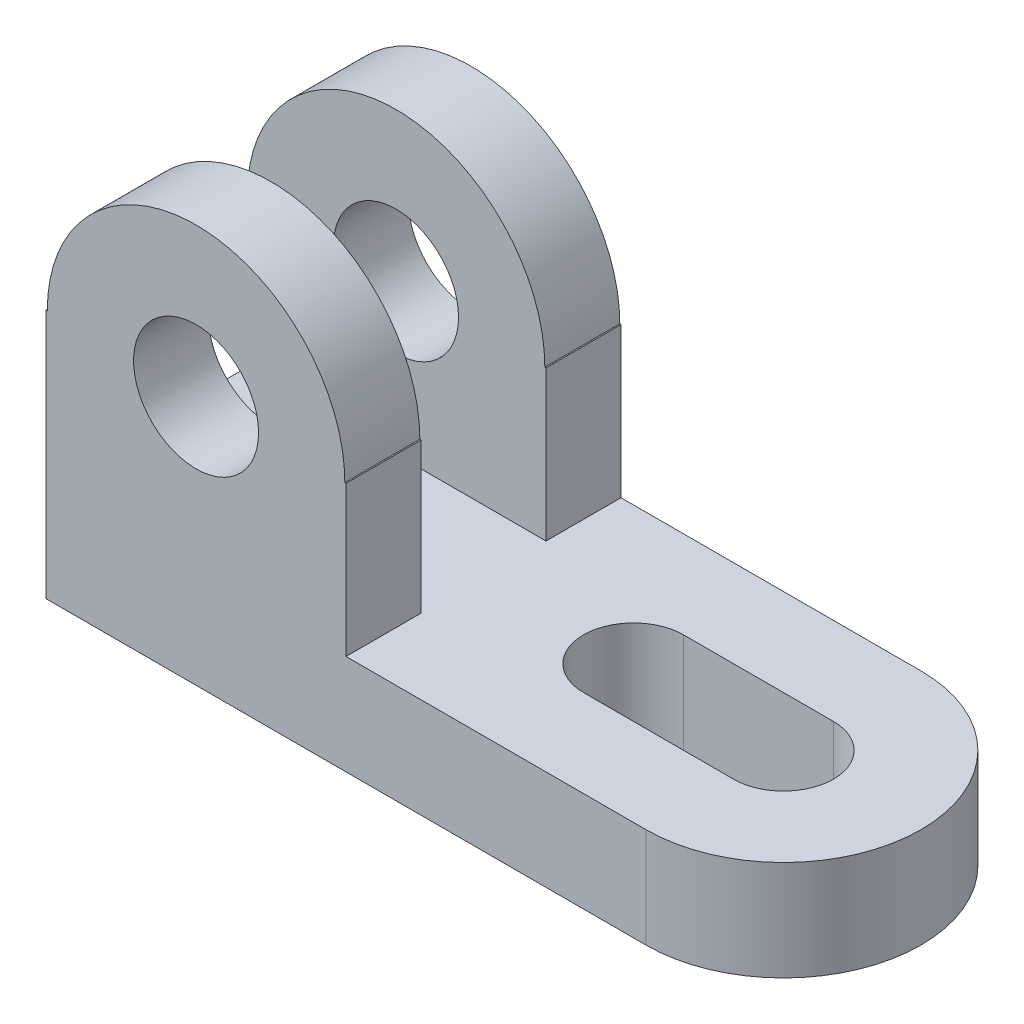
ISO-10303-21;
HEADER;
FILE_DESCRIPTION(('STEP AP214'),'2;1');
FILE_NAME('part.step','',(''),(''),'','','');
FILE_SCHEMA(('AUTOMOTIVE_DESIGN { 1 0 10303 214 1 1 1 1 }'));
ENDSEC;
DATA;
#1=APPLICATION_CONTEXT('core data for automotive mechanical design processes');
#2=APPLICATION_PROTOCOL_DEFINITION('international standard','automotive_design',2000,#1);
#3=PRODUCT_CONTEXT('',#1,'mechanical');
#4=PRODUCT('Part','Part','',(#3));
#5=PRODUCT_RELATED_PRODUCT_CATEGORY('part','',(#4));
#6=PRODUCT_DEFINITION_FORMATION('','',#4);
#7=PRODUCT_DEFINITION_CONTEXT('part definition',#1,'design');
#8=PRODUCT_DEFINITION('design','',#6,#7);
#9=PRODUCT_DEFINITION_SHAPE('','',#8);
#10=(LENGTH_UNIT() NAMED_UNIT(*) SI_UNIT(.MILLI.,.METRE.));
#11=(NAMED_UNIT(*) PLANE_ANGLE_UNIT() SI_UNIT($,.RADIAN.));
#12=(NAMED_UNIT(*) SI_UNIT($,.STERADIAN.) SOLID_ANGLE_UNIT());
#13=UNCERTAINTY_MEASURE_WITH_UNIT(LENGTH_MEASURE(1.E-05),#10,'distance_accuracy_value','');
#14=(GEOMETRIC_REPRESENTATION_CONTEXT(3) GLOBAL_UNCERTAINTY_ASSIGNED_CONTEXT((#13)) GLOBAL_UNIT_ASSIGNED_CONTEXT((#10,
#11,#12)) REPRESENTATION_CONTEXT('',''));
#15=CARTESIAN_POINT('',(0.,0.,0.));
#16=DIRECTION('',(0.,0.,1.));
#17=DIRECTION('',(1.,0.,0.));
#18=AXIS2_PLACEMENT_3D('',#15,#16,#17);
#19=CARTESIAN_POINT('',(0.,16.,0.));
#20=DIRECTION('',(0.,1.,0.));
#21=DIRECTION('',(0.,0.,1.));
#22=AXIS2_PLACEMENT_3D('',#19,#20,#21);
#23=PLANE('',#22);
#24=CARTESIAN_POINT('',(37.,16.,0.));
#25=DIRECTION('',(0.,1.,0.));
#26=DIRECTION('',(0.,0.,1.));
#27=AXIS2_PLACEMENT_3D('',#24,#25,#26);
#28=CIRCLE('',#27,8.);
#29=CARTESIAN_POINT('',(37.,16.,8.));
#30=VERTEX_POINT('',#29);
#31=CARTESIAN_POINT('',(37.,16.,-8.));
#32=VERTEX_POINT('',#31);
#33=EDGE_CURVE('E285',#30,#32,#28,.T.);
#34=ORIENTED_EDGE('',*,*,#33,.F.);
#35=DIRECTION('',(1.,0.,0.));
#36=VECTOR('',#35,1.);
#37=CARTESIAN_POINT('',(37.,16.,8.));
#38=LINE('',#37,#36);
#39=CARTESIAN_POINT('',(13.,16.,8.));
#40=VERTEX_POINT('',#39);
#41=EDGE_CURVE('E303',#40,#30,#38,.T.);
#42=ORIENTED_EDGE('',*,*,#41,.F.);
#43=CARTESIAN_POINT('',(13.,16.,0.));
#44=DIRECTION('',(0.,1.,0.));
#45=DIRECTION('',(0.,0.,1.));
#46=AXIS2_PLACEMENT_3D('',#43,#44,#45);
#47=CIRCLE('',#46,8.);
#48=CARTESIAN_POINT('',(13.,16.,-8.));
#49=VERTEX_POINT('',#48);
#50=EDGE_CURVE('E322',#49,#40,#47,.T.);
#51=ORIENTED_EDGE('',*,*,#50,.F.);
#52=DIRECTION('',(-1.,0.,0.));
#53=VECTOR('',#52,1.);
#54=CARTESIAN_POINT('',(37.,16.,-8.));
#55=LINE('',#54,#53);
#56=EDGE_CURVE('E318',#32,#49,#55,.T.);
#57=ORIENTED_EDGE('',*,*,#56,.F.);
#58=EDGE_LOOP('',(#34,#42,#51,#57));
#59=FACE_BOUND('',#58,.T.);
#60=DIRECTION('',(1.,0.,0.));
#61=VECTOR('',#60,1.);
#62=CARTESIAN_POINT('',(0.,16.,-22.));
#63=LINE('',#62,#61);
#64=CARTESIAN_POINT('',(-11.,16.,-22.));
#65=VERTEX_POINT('',#64);
#66=CARTESIAN_POINT('',(37.,16.,-22.));
#67=VERTEX_POINT('',#66);
#68=EDGE_CURVE('E350',#65,#67,#63,.T.);
#69=ORIENTED_EDGE('',*,*,#68,.F.);
#70=DIRECTION('',(0.,0.,-1.));
#71=VECTOR('',#70,1.);
#72=CARTESIAN_POINT('',(-11.,16.,-10.));
#73=LINE('',#72,#71);
#74=CARTESIAN_POINT('',(-11.,16.,-10.));
#75=VERTEX_POINT('',#74);
#76=EDGE_CURVE('E239',#75,#65,#73,.T.);
#77=ORIENTED_EDGE('',*,*,#76,.F.);
#78=DIRECTION('',(-1.,0.,0.));
#79=VECTOR('',#78,1.);
#80=CARTESIAN_POINT('',(0.,16.,-10.));
#81=LINE('',#80,#79);
#82=CARTESIAN_POINT('',(-59.,16.,-10.));
#83=VERTEX_POINT('',#82);
#84=EDGE_CURVE('E204',#75,#83,#81,.T.);
#85=ORIENTED_EDGE('',*,*,#84,.T.);
#86=DIRECTION('',(0.,0.,1.));
#87=VECTOR('',#86,1.);
#88=CARTESIAN_POINT('',(-59.,16.,0.));
#89=LINE('',#88,#87);
#90=CARTESIAN_POINT('',(-59.,16.,10.));
#91=VERTEX_POINT('',#90);
#92=EDGE_CURVE('E353',#83,#91,#89,.T.);
#93=ORIENTED_EDGE('',*,*,#92,.T.);
#94=DIRECTION('',(-1.,0.,0.));
#95=VECTOR('',#94,1.);
#96=CARTESIAN_POINT('',(0.,16.,10.));
#97=LINE('',#96,#95);
#98=CARTESIAN_POINT('',(-11.,16.,10.));
#99=VERTEX_POINT('',#98);
#100=EDGE_CURVE('E256',#99,#91,#97,.T.);
#101=ORIENTED_EDGE('',*,*,#100,.F.);
#102=DIRECTION('',(0.,0.,1.));
#103=VECTOR('',#102,1.);
#104=CARTESIAN_POINT('',(-11.,16.,10.));
#105=LINE('',#104,#103);
#106=CARTESIAN_POINT('',(-11.,16.,22.));
#107=VERTEX_POINT('',#106);
#108=EDGE_CURVE('E289',#99,#107,#105,.T.);
#109=ORIENTED_EDGE('',*,*,#108,.T.);
#110=DIRECTION('',(1.,0.,0.));
#111=VECTOR('',#110,1.);
#112=CARTESIAN_POINT('',(0.,16.,22.));
#113=LINE('',#112,#111);
#114=CARTESIAN_POINT('',(37.,16.,22.));
#115=VERTEX_POINT('',#114);
#116=EDGE_CURVE('E342',#107,#115,#113,.T.);
#117=ORIENTED_EDGE('',*,*,#116,.T.);
#118=CARTESIAN_POINT('',(37.,16.,0.));
#119=DIRECTION('',(0.,1.,0.));
#120=DIRECTION('',(0.,0.,1.));
#121=AXIS2_PLACEMENT_3D('',#118,#119,#120);
#122=CIRCLE('',#121,22.);
#123=EDGE_CURVE('E345',#115,#67,#122,.T.);
#124=ORIENTED_EDGE('',*,*,#123,.T.);
#125=EDGE_LOOP('',(#69,#77,#85,#93,#101,#109,#117,#124));
#126=FACE_BOUND('',#125,.T.);
#127=ADVANCED_FACE('F45',(#59,#126),#23,.T.);
#128=CARTESIAN_POINT('',(0.,16.,22.));
#129=DIRECTION('',(0.,0.,-1.));
#130=DIRECTION('',(-1.,0.,0.));
#131=AXIS2_PLACEMENT_3D('',#128,#129,#130);
#132=PLANE('',#131);
#133=DIRECTION('',(1.,0.,0.));
#134=VECTOR('',#133,1.);
#135=CARTESIAN_POINT('',(0.,0.,22.));
#136=LINE('',#135,#134);
#137=CARTESIAN_POINT('',(-59.,0.,22.));
#138=VERTEX_POINT('',#137);
#139=CARTESIAN_POINT('',(37.,0.,22.));
#140=VERTEX_POINT('',#139);
#141=EDGE_CURVE('E332',#138,#140,#136,.T.);
#142=ORIENTED_EDGE('',*,*,#141,.T.);
#143=DIRECTION('',(0.,-1.,0.));
#144=VECTOR('',#143,1.);
#145=CARTESIAN_POINT('',(37.,16.,22.));
#146=LINE('',#145,#144);
#147=EDGE_CURVE('E11',#115,#140,#146,.T.);
#148=ORIENTED_EDGE('',*,*,#147,.F.);
#149=ORIENTED_EDGE('',*,*,#116,.F.);
#150=DIRECTION('',(0.,1.,0.));
#151=VECTOR('',#150,1.);
#152=CARTESIAN_POINT('',(-11.,0.,22.));
#153=LINE('',#152,#151);
#154=CARTESIAN_POINT('',(-11.,40.,22.));
#155=VERTEX_POINT('',#154);
#156=EDGE_CURVE('E69',#107,#155,#153,.T.);
#157=ORIENTED_EDGE('',*,*,#156,.T.);
#158=DIRECTION('',(1.,0.,0.));
#159=VECTOR('',#158,1.);
#160=CARTESIAN_POINT('',(0.,40.,22.));
#161=LINE('',#160,#159);
#162=CARTESIAN_POINT('',(-11.1921277446553,40.,22.));
#163=VERTEX_POINT('',#162);
#164=EDGE_CURVE('E276',#163,#155,#161,.T.);
#165=ORIENTED_EDGE('',*,*,#164,.F.);
#166=CARTESIAN_POINT('',(-35.,40.,22.));
#167=DIRECTION('',(0.,0.,1.));
#168=DIRECTION('',(1.,0.,0.));
#169=AXIS2_PLACEMENT_3D('',#166,#167,#168);
#170=CIRCLE('',#169,23.8078722553447);
#171=CARTESIAN_POINT('',(-58.8078722553447,40.,22.));
#172=VERTEX_POINT('',#171);
#173=EDGE_CURVE('E235',#163,#172,#170,.T.);
#174=ORIENTED_EDGE('',*,*,#173,.T.);
#175=CARTESIAN_POINT('',(-59.,40.,22.));
#176=VERTEX_POINT('',#175);
#177=EDGE_CURVE('E272',#176,#172,#161,.T.);
#178=ORIENTED_EDGE('',*,*,#177,.F.);
#179=DIRECTION('',(0.,-1.,0.));
#180=VECTOR('',#179,1.);
#181=CARTESIAN_POINT('',(-59.,16.,22.));
#182=LINE('',#181,#180);
#183=EDGE_CURVE('E356',#176,#138,#182,.T.);
#184=ORIENTED_EDGE('',*,*,#183,.T.);
#185=EDGE_LOOP('',(#142,#148,#149,#157,#165,#174,#178,#184));
#186=FACE_BOUND('',#185,.T.);
#187=CARTESIAN_POINT('',(-35.,40.,22.));
#188=DIRECTION('',(0.,0.,1.));
#189=DIRECTION('',(1.,0.,0.));
#190=AXIS2_PLACEMENT_3D('',#187,#188,#189);
#191=CIRCLE('',#190,10.);
#192=CARTESIAN_POINT('',(-25.,40.,22.));
#193=VERTEX_POINT('',#192);
#194=EDGE_CURVE('E249',#193,#193,#191,.T.);
#195=ORIENTED_EDGE('',*,*,#194,.F.);
#196=EDGE_LOOP('',(#195));
#197=FACE_BOUND('',#196,.T.);
#198=ADVANCED_FACE('F47',(#186,#197),#132,.F.);
#199=CARTESIAN_POINT('',(37.,16.,0.));
#200=DIRECTION('',(0.,-1.,0.));
#201=DIRECTION('',(0.,0.,-1.));
#202=AXIS2_PLACEMENT_3D('',#199,#200,#201);
#203=CYLINDRICAL_SURFACE('',#202,22.);
#204=CARTESIAN_POINT('',(37.,0.,0.));
#205=DIRECTION('',(0.,1.,0.));
#206=DIRECTION('',(0.,0.,1.));
#207=AXIS2_PLACEMENT_3D('',#204,#205,#206);
#208=CIRCLE('',#207,22.);
#209=CARTESIAN_POINT('',(37.,0.,-22.));
#210=VERTEX_POINT('',#209);
#211=EDGE_CURVE('E360',#140,#210,#208,.T.);
#212=ORIENTED_EDGE('',*,*,#211,.T.);
#213=DIRECTION('',(0.,-1.,0.));
#214=VECTOR('',#213,1.);
#215=CARTESIAN_POINT('',(37.,16.,-22.));
#216=LINE('',#215,#214);
#217=EDGE_CURVE('E54',#67,#210,#216,.T.);
#218=ORIENTED_EDGE('',*,*,#217,.F.);
#219=ORIENTED_EDGE('',*,*,#123,.F.);
#220=ORIENTED_EDGE('',*,*,#147,.T.);
#221=EDGE_LOOP('',(#212,#218,#219,#220));
#222=FACE_BOUND('',#221,.T.);
#223=ADVANCED_FACE('F383',(#222),#203,.T.);
#224=CARTESIAN_POINT('',(0.,16.,-22.));
#225=DIRECTION('',(0.,0.,-1.));
#226=DIRECTION('',(-1.,0.,0.));
#227=AXIS2_PLACEMENT_3D('',#224,#225,#226);
#228=PLANE('',#227);
#229=DIRECTION('',(1.,0.,0.));
#230=VECTOR('',#229,1.);
#231=CARTESIAN_POINT('',(0.,0.,-22.));
#232=LINE('',#231,#230);
#233=CARTESIAN_POINT('',(-59.,0.,-22.));
#234=VERTEX_POINT('',#233);
#235=EDGE_CURVE('E364',#234,#210,#232,.T.);
#236=ORIENTED_EDGE('',*,*,#235,.F.);
#237=DIRECTION('',(0.,-1.,0.));
#238=VECTOR('',#237,1.);
#239=CARTESIAN_POINT('',(-59.,16.,-22.));
#240=LINE('',#239,#238);
#241=CARTESIAN_POINT('',(-59.,40.,-22.));
#242=VERTEX_POINT('',#241);
#243=EDGE_CURVE('E373',#242,#234,#240,.T.);
#244=ORIENTED_EDGE('',*,*,#243,.F.);
#245=DIRECTION('',(1.,0.,0.));
#246=VECTOR('',#245,1.);
#247=CARTESIAN_POINT('',(0.,40.,-22.));
#248=LINE('',#247,#246);
#249=CARTESIAN_POINT('',(-58.8078722553447,40.,-22.));
#250=VERTEX_POINT('',#249);
#251=EDGE_CURVE('E227',#242,#250,#248,.T.);
#252=ORIENTED_EDGE('',*,*,#251,.T.);
#253=CARTESIAN_POINT('',(-35.,40.,-22.));
#254=DIRECTION('',(0.,0.,1.));
#255=DIRECTION('',(1.,0.,0.));
#256=AXIS2_PLACEMENT_3D('',#253,#254,#255);
#257=CIRCLE('',#256,23.8078722553447);
#258=CARTESIAN_POINT('',(-11.1921277446553,40.,-22.));
#259=VERTEX_POINT('',#258);
#260=EDGE_CURVE('E222',#259,#250,#257,.T.);
#261=ORIENTED_EDGE('',*,*,#260,.F.);
#262=CARTESIAN_POINT('',(-11.,40.,-22.));
#263=VERTEX_POINT('',#262);
#264=EDGE_CURVE('E177',#259,#263,#248,.T.);
#265=ORIENTED_EDGE('',*,*,#264,.T.);
#266=DIRECTION('',(0.,1.,0.));
#267=VECTOR('',#266,1.);
#268=CARTESIAN_POINT('',(-11.,0.,-22.));
#269=LINE('',#268,#267);
#270=EDGE_CURVE('E61',#65,#263,#269,.T.);
#271=ORIENTED_EDGE('',*,*,#270,.F.);
#272=ORIENTED_EDGE('',*,*,#68,.T.);
#273=ORIENTED_EDGE('',*,*,#217,.T.);
#274=EDGE_LOOP('',(#236,#244,#252,#261,#265,#271,#272,#273));
#275=FACE_BOUND('',#274,.T.);
#276=CARTESIAN_POINT('',(-35.,40.,-22.));
#277=DIRECTION('',(0.,0.,1.));
#278=DIRECTION('',(1.,0.,0.));
#279=AXIS2_PLACEMENT_3D('',#276,#277,#278);
#280=CIRCLE('',#279,10.);
#281=CARTESIAN_POINT('',(-25.,40.,-22.));
#282=VERTEX_POINT('',#281);
#283=EDGE_CURVE('E193',#282,#282,#280,.T.);
#284=ORIENTED_EDGE('',*,*,#283,.T.);
#285=EDGE_LOOP('',(#284));
#286=FACE_BOUND('',#285,.T.);
#287=ADVANCED_FACE('F378',(#275,#286),#228,.T.);
#288=CARTESIAN_POINT('',(-59.,16.,0.));
#289=DIRECTION('',(1.,0.,0.));
#290=DIRECTION('',(0.,0.,-1.));
#291=AXIS2_PLACEMENT_3D('',#288,#289,#290);
#292=PLANE('',#291);
#293=DIRECTION('',(0.,0.,1.));
#294=VECTOR('',#293,1.);
#295=CARTESIAN_POINT('',(-59.,0.,0.));
#296=LINE('',#295,#294);
#297=EDGE_CURVE('E346',#234,#138,#296,.T.);
#298=ORIENTED_EDGE('',*,*,#297,.T.);
#299=ORIENTED_EDGE('',*,*,#183,.F.);
#300=DIRECTION('',(0.,0.,1.));
#301=VECTOR('',#300,1.);
#302=CARTESIAN_POINT('',(-59.,40.,10.));
#303=LINE('',#302,#301);
#304=CARTESIAN_POINT('',(-59.,40.,10.));
#305=VERTEX_POINT('',#304);
#306=EDGE_CURVE('E292',#305,#176,#303,.T.);
#307=ORIENTED_EDGE('',*,*,#306,.F.);
#308=DIRECTION('',(0.,1.,0.));
#309=VECTOR('',#308,1.);
#310=CARTESIAN_POINT('',(-59.,0.,10.));
#311=LINE('',#310,#309);
#312=EDGE_CURVE('E252',#91,#305,#311,.T.);
#313=ORIENTED_EDGE('',*,*,#312,.F.);
#314=ORIENTED_EDGE('',*,*,#92,.F.);
#315=DIRECTION('',(0.,1.,0.));
#316=VECTOR('',#315,1.);
#317=CARTESIAN_POINT('',(-59.,0.,-10.));
#318=LINE('',#317,#316);
#319=CARTESIAN_POINT('',(-59.,40.,-10.));
#320=VERTEX_POINT('',#319);
#321=EDGE_CURVE('E207',#83,#320,#318,.T.);
#322=ORIENTED_EDGE('',*,*,#321,.T.);
#323=DIRECTION('',(0.,0.,-1.));
#324=VECTOR('',#323,1.);
#325=CARTESIAN_POINT('',(-59.,40.,-10.));
#326=LINE('',#325,#324);
#327=EDGE_CURVE('E236',#320,#242,#326,.T.);
#328=ORIENTED_EDGE('',*,*,#327,.T.);
#329=ORIENTED_EDGE('',*,*,#243,.T.);
#330=EDGE_LOOP('',(#298,#299,#307,#313,#314,#322,#328,#329));
#331=FACE_BOUND('',#330,.T.);
#332=ADVANCED_FACE('F389',(#331),#292,.F.);
#333=CARTESIAN_POINT('',(0.,0.,0.));
#334=DIRECTION('',(0.,1.,0.));
#335=DIRECTION('',(0.,0.,1.));
#336=AXIS2_PLACEMENT_3D('',#333,#334,#335);
#337=PLANE('',#336);
#338=DIRECTION('',(1.,0.,0.));
#339=VECTOR('',#338,1.);
#340=CARTESIAN_POINT('',(37.,0.,8.));
#341=LINE('',#340,#339);
#342=CARTESIAN_POINT('',(13.,0.,8.));
#343=VERTEX_POINT('',#342);
#344=CARTESIAN_POINT('',(37.,0.,8.));
#345=VERTEX_POINT('',#344);
#346=EDGE_CURVE('E311',#343,#345,#341,.T.);
#347=ORIENTED_EDGE('',*,*,#346,.T.);
#348=CARTESIAN_POINT('',(37.,0.,0.));
#349=DIRECTION('',(0.,1.,0.));
#350=DIRECTION('',(0.,0.,1.));
#351=AXIS2_PLACEMENT_3D('',#348,#349,#350);
#352=CIRCLE('',#351,8.);
#353=CARTESIAN_POINT('',(37.,0.,-8.));
#354=VERTEX_POINT('',#353);
#355=EDGE_CURVE('E298',#345,#354,#352,.T.);
#356=ORIENTED_EDGE('',*,*,#355,.T.);
#357=DIRECTION('',(-1.,0.,0.));
#358=VECTOR('',#357,1.);
#359=CARTESIAN_POINT('',(37.,0.,-8.));
#360=LINE('',#359,#358);
#361=CARTESIAN_POINT('',(13.,0.,-8.));
#362=VERTEX_POINT('',#361);
#363=EDGE_CURVE('E302',#354,#362,#360,.T.);
#364=ORIENTED_EDGE('',*,*,#363,.T.);
#365=CARTESIAN_POINT('',(13.,0.,0.));
#366=DIRECTION('',(0.,1.,0.));
#367=DIRECTION('',(0.,0.,1.));
#368=AXIS2_PLACEMENT_3D('',#365,#366,#367);
#369=CIRCLE('',#368,8.);
#370=EDGE_CURVE('E307',#362,#343,#369,.T.);
#371=ORIENTED_EDGE('',*,*,#370,.T.);
#372=EDGE_LOOP('',(#347,#356,#364,#371));
#373=FACE_BOUND('',#372,.T.);
#374=ORIENTED_EDGE('',*,*,#141,.F.);
#375=ORIENTED_EDGE('',*,*,#297,.F.);
#376=ORIENTED_EDGE('',*,*,#235,.T.);
#377=ORIENTED_EDGE('',*,*,#211,.F.);
#378=EDGE_LOOP('',(#374,#375,#376,#377));
#379=FACE_BOUND('',#378,.T.);
#380=ADVANCED_FACE('F388',(#373,#379),#337,.F.);
#381=CARTESIAN_POINT('',(37.,0.,0.));
#382=DIRECTION('',(0.,1.,0.));
#383=DIRECTION('',(0.,0.,1.));
#384=AXIS2_PLACEMENT_3D('',#381,#382,#383);
#385=CYLINDRICAL_SURFACE('',#384,8.);
#386=ORIENTED_EDGE('',*,*,#33,.T.);
#387=DIRECTION('',(0.,1.,0.));
#388=VECTOR('',#387,1.);
#389=CARTESIAN_POINT('',(37.,0.,-8.));
#390=LINE('',#389,#388);
#391=EDGE_CURVE('E315',#354,#32,#390,.T.);
#392=ORIENTED_EDGE('',*,*,#391,.F.);
#393=ORIENTED_EDGE('',*,*,#355,.F.);
#394=DIRECTION('',(0.,1.,0.));
#395=VECTOR('',#394,1.);
#396=CARTESIAN_POINT('',(37.,0.,8.));
#397=LINE('',#396,#395);
#398=EDGE_CURVE('E329',#345,#30,#397,.T.);
#399=ORIENTED_EDGE('',*,*,#398,.T.);
#400=EDGE_LOOP('',(#386,#392,#393,#399));
#401=FACE_BOUND('',#400,.T.);
#402=ADVANCED_FACE('F436',(#401),#385,.F.);
#403=CARTESIAN_POINT('',(37.,0.,8.));
#404=DIRECTION('',(0.,0.,1.));
#405=DIRECTION('',(1.,0.,0.));
#406=AXIS2_PLACEMENT_3D('',#403,#404,#405);
#407=PLANE('',#406);
#408=ORIENTED_EDGE('',*,*,#41,.T.);
#409=ORIENTED_EDGE('',*,*,#398,.F.);
#410=ORIENTED_EDGE('',*,*,#346,.F.);
#411=DIRECTION('',(0.,1.,0.));
#412=VECTOR('',#411,1.);
#413=CARTESIAN_POINT('',(13.,0.,8.));
#414=LINE('',#413,#412);
#415=EDGE_CURVE('E333',#343,#40,#414,.T.);
#416=ORIENTED_EDGE('',*,*,#415,.T.);
#417=EDGE_LOOP('',(#408,#409,#410,#416));
#418=FACE_BOUND('',#417,.T.);
#419=ADVANCED_FACE('F468',(#418),#407,.F.);
#420=CARTESIAN_POINT('',(13.,0.,0.));
#421=DIRECTION('',(0.,1.,0.));
#422=DIRECTION('',(0.,0.,1.));
#423=AXIS2_PLACEMENT_3D('',#420,#421,#422);
#424=CYLINDRICAL_SURFACE('',#423,8.);
#425=ORIENTED_EDGE('',*,*,#50,.T.);
#426=ORIENTED_EDGE('',*,*,#415,.F.);
#427=ORIENTED_EDGE('',*,*,#370,.F.);
#428=DIRECTION('',(0.,1.,0.));
#429=VECTOR('',#428,1.);
#430=CARTESIAN_POINT('',(13.,0.,-8.));
#431=LINE('',#430,#429);
#432=EDGE_CURVE('E336',#362,#49,#431,.T.);
#433=ORIENTED_EDGE('',*,*,#432,.T.);
#434=EDGE_LOOP('',(#425,#426,#427,#433));
#435=FACE_BOUND('',#434,.T.);
#436=ADVANCED_FACE('F475',(#435),#424,.F.);
#437=CARTESIAN_POINT('',(37.,0.,-8.));
#438=DIRECTION('',(0.,0.,-1.));
#439=DIRECTION('',(-1.,0.,0.));
#440=AXIS2_PLACEMENT_3D('',#437,#438,#439);
#441=PLANE('',#440);
#442=ORIENTED_EDGE('',*,*,#56,.T.);
#443=ORIENTED_EDGE('',*,*,#432,.F.);
#444=ORIENTED_EDGE('',*,*,#363,.F.);
#445=ORIENTED_EDGE('',*,*,#391,.T.);
#446=EDGE_LOOP('',(#442,#443,#444,#445));
#447=FACE_BOUND('',#446,.T.);
#448=ADVANCED_FACE('F483',(#447),#441,.F.);
#449=CARTESIAN_POINT('',(-35.,40.,10.));
#450=DIRECTION('',(0.,0.,1.));
#451=DIRECTION('',(1.,0.,0.));
#452=AXIS2_PLACEMENT_3D('',#449,#450,#451);
#453=CYLINDRICAL_SURFACE('',#452,23.8078722553447);
#454=ORIENTED_EDGE('',*,*,#173,.F.);
#455=DIRECTION('',(0.,0.,1.));
#456=VECTOR('',#455,1.);
#457=CARTESIAN_POINT('',(-11.1921277446553,40.,10.));
#458=LINE('',#457,#456);
#459=CARTESIAN_POINT('',(-11.1921277446553,40.,10.));
#460=VERTEX_POINT('',#459);
#461=EDGE_CURVE('E282',#460,#163,#458,.T.);
#462=ORIENTED_EDGE('',*,*,#461,.F.);
#463=CARTESIAN_POINT('',(-35.,40.,10.));
#464=DIRECTION('',(0.,0.,1.));
#465=DIRECTION('',(1.,0.,0.));
#466=AXIS2_PLACEMENT_3D('',#463,#464,#465);
#467=CIRCLE('',#466,23.8078722553447);
#468=CARTESIAN_POINT('',(-58.8078722553447,40.,10.));
#469=VERTEX_POINT('',#468);
#470=EDGE_CURVE('E244',#460,#469,#467,.T.);
#471=ORIENTED_EDGE('',*,*,#470,.T.);
#472=DIRECTION('',(0.,0.,1.));
#473=VECTOR('',#472,1.);
#474=CARTESIAN_POINT('',(-58.8078722553447,40.,10.));
#475=LINE('',#474,#473);
#476=EDGE_CURVE('E268',#469,#172,#475,.T.);
#477=ORIENTED_EDGE('',*,*,#476,.T.);
#478=EDGE_LOOP('',(#454,#462,#471,#477));
#479=FACE_BOUND('',#478,.T.);
#480=ADVANCED_FACE('F491',(#479),#453,.T.);
#481=CARTESIAN_POINT('',(0.,40.,10.));
#482=DIRECTION('',(0.,-1.,0.));
#483=DIRECTION('',(0.,0.,-1.));
#484=AXIS2_PLACEMENT_3D('',#481,#482,#483);
#485=PLANE('',#484);
#486=ORIENTED_EDGE('',*,*,#164,.T.);
#487=DIRECTION('',(0.,0.,1.));
#488=VECTOR('',#487,1.);
#489=CARTESIAN_POINT('',(-11.,40.,10.));
#490=LINE('',#489,#488);
#491=CARTESIAN_POINT('',(-11.,40.,10.));
#492=VERTEX_POINT('',#491);
#493=EDGE_CURVE('E286',#492,#155,#490,.T.);
#494=ORIENTED_EDGE('',*,*,#493,.F.);
#495=DIRECTION('',(1.,0.,0.));
#496=VECTOR('',#495,1.);
#497=CARTESIAN_POINT('',(0.,40.,10.));
#498=LINE('',#497,#496);
#499=EDGE_CURVE('E253',#460,#492,#498,.T.);
#500=ORIENTED_EDGE('',*,*,#499,.F.);
#501=ORIENTED_EDGE('',*,*,#461,.T.);
#502=EDGE_LOOP('',(#486,#494,#500,#501));
#503=FACE_BOUND('',#502,.T.);
#504=ADVANCED_FACE('F498',(#503),#485,.F.);
#505=CARTESIAN_POINT('',(-11.,0.,10.));
#506=DIRECTION('',(1.,0.,0.));
#507=DIRECTION('',(0.,0.,-1.));
#508=AXIS2_PLACEMENT_3D('',#505,#506,#507);
#509=PLANE('',#508);
#510=ORIENTED_EDGE('',*,*,#156,.F.);
#511=ORIENTED_EDGE('',*,*,#108,.F.);
#512=DIRECTION('',(0.,1.,0.));
#513=VECTOR('',#512,1.);
#514=CARTESIAN_POINT('',(-11.,0.,10.));
#515=LINE('',#514,#513);
#516=EDGE_CURVE('E260',#99,#492,#515,.T.);
#517=ORIENTED_EDGE('',*,*,#516,.T.);
#518=ORIENTED_EDGE('',*,*,#493,.T.);
#519=EDGE_LOOP('',(#510,#511,#517,#518));
#520=FACE_BOUND('',#519,.T.);
#521=ADVANCED_FACE('F506',(#520),#509,.T.);
#522=ORIENTED_EDGE('',*,*,#177,.T.);
#523=ORIENTED_EDGE('',*,*,#476,.F.);
#524=EDGE_CURVE('E248',#305,#469,#498,.T.);
#525=ORIENTED_EDGE('',*,*,#524,.F.);
#526=ORIENTED_EDGE('',*,*,#306,.T.);
#527=EDGE_LOOP('',(#522,#523,#525,#526));
#528=FACE_BOUND('',#527,.T.);
#529=ADVANCED_FACE('F398',(#528),#485,.F.);
#530=CARTESIAN_POINT('',(-35.,40.,10.));
#531=DIRECTION('',(0.,0.,1.));
#532=DIRECTION('',(1.,0.,0.));
#533=AXIS2_PLACEMENT_3D('',#530,#531,#532);
#534=CYLINDRICAL_SURFACE('',#533,10.);
#535=CARTESIAN_POINT('',(-35.,40.,10.));
#536=DIRECTION('',(0.,0.,1.));
#537=DIRECTION('',(1.,0.,0.));
#538=AXIS2_PLACEMENT_3D('',#535,#536,#537);
#539=CIRCLE('',#538,10.);
#540=CARTESIAN_POINT('',(-25.,40.,10.));
#541=VERTEX_POINT('',#540);
#542=EDGE_CURVE('E264',#541,#541,#539,.T.);
#543=ORIENTED_EDGE('',*,*,#542,.F.);
#544=EDGE_LOOP('',(#543));
#545=FACE_BOUND('',#544,.T.);
#546=ORIENTED_EDGE('',*,*,#194,.T.);
#547=EDGE_LOOP('',(#546));
#548=FACE_BOUND('',#547,.T.);
#549=ADVANCED_FACE('F520',(#545,#548),#534,.F.);
#550=CARTESIAN_POINT('',(0.,0.,10.));
#551=DIRECTION('',(0.,0.,1.));
#552=DIRECTION('',(1.,0.,0.));
#553=AXIS2_PLACEMENT_3D('',#550,#551,#552);
#554=PLANE('',#553);
#555=ORIENTED_EDGE('',*,*,#470,.F.);
#556=ORIENTED_EDGE('',*,*,#499,.T.);
#557=ORIENTED_EDGE('',*,*,#516,.F.);
#558=ORIENTED_EDGE('',*,*,#100,.T.);
#559=ORIENTED_EDGE('',*,*,#312,.T.);
#560=ORIENTED_EDGE('',*,*,#524,.T.);
#561=EDGE_LOOP('',(#555,#556,#557,#558,#559,#560));
#562=FACE_BOUND('',#561,.T.);
#563=ORIENTED_EDGE('',*,*,#542,.T.);
#564=EDGE_LOOP('',(#563));
#565=FACE_BOUND('',#564,.T.);
#566=ADVANCED_FACE('F403',(#562,#565),#554,.F.);
#567=CARTESIAN_POINT('',(-35.,40.,-10.));
#568=DIRECTION('',(0.,0.,-1.));
#569=DIRECTION('',(-1.,0.,0.));
#570=AXIS2_PLACEMENT_3D('',#567,#568,#569);
#571=CYLINDRICAL_SURFACE('',#570,23.8078722553447);
#572=ORIENTED_EDGE('',*,*,#260,.T.);
#573=DIRECTION('',(0.,0.,-1.));
#574=VECTOR('',#573,1.);
#575=CARTESIAN_POINT('',(-58.8078722553447,40.,-10.));
#576=LINE('',#575,#574);
#577=CARTESIAN_POINT('',(-58.8078722553447,40.,-10.));
#578=VERTEX_POINT('',#577);
#579=EDGE_CURVE('E188',#578,#250,#576,.T.);
#580=ORIENTED_EDGE('',*,*,#579,.F.);
#581=CARTESIAN_POINT('',(-35.,40.,-10.));
#582=DIRECTION('',(0.,0.,1.));
#583=DIRECTION('',(1.,0.,0.));
#584=AXIS2_PLACEMENT_3D('',#581,#582,#583);
#585=CIRCLE('',#584,23.8078722553447);
#586=CARTESIAN_POINT('',(-11.1921277446553,40.,-10.));
#587=VERTEX_POINT('',#586);
#588=EDGE_CURVE('E186',#587,#578,#585,.T.);
#589=ORIENTED_EDGE('',*,*,#588,.F.);
#590=DIRECTION('',(0.,0.,-1.));
#591=VECTOR('',#590,1.);
#592=CARTESIAN_POINT('',(-11.1921277446553,40.,-10.));
#593=LINE('',#592,#591);
#594=EDGE_CURVE('E172',#587,#259,#593,.T.);
#595=ORIENTED_EDGE('',*,*,#594,.T.);
#596=EDGE_LOOP('',(#572,#580,#589,#595));
#597=FACE_BOUND('',#596,.T.);
#598=ADVANCED_FACE('F187',(#597),#571,.T.);
#599=CARTESIAN_POINT('',(0.,40.,-10.));
#600=DIRECTION('',(0.,1.,0.));
#601=DIRECTION('',(0.,0.,1.));
#602=AXIS2_PLACEMENT_3D('',#599,#600,#601);
#603=PLANE('',#602);
#604=ORIENTED_EDGE('',*,*,#251,.F.);
#605=ORIENTED_EDGE('',*,*,#327,.F.);
#606=DIRECTION('',(1.,0.,0.));
#607=VECTOR('',#606,1.);
#608=CARTESIAN_POINT('',(0.,40.,-10.));
#609=LINE('',#608,#607);
#610=EDGE_CURVE('E202',#320,#578,#609,.T.);
#611=ORIENTED_EDGE('',*,*,#610,.T.);
#612=ORIENTED_EDGE('',*,*,#579,.T.);
#613=EDGE_LOOP('',(#604,#605,#611,#612));
#614=FACE_BOUND('',#613,.T.);
#615=ADVANCED_FACE('F415',(#614),#603,.T.);
#616=CARTESIAN_POINT('',(-11.,0.,-10.));
#617=DIRECTION('',(-1.,0.,0.));
#618=DIRECTION('',(0.,0.,1.));
#619=AXIS2_PLACEMENT_3D('',#616,#617,#618);
#620=PLANE('',#619);
#621=ORIENTED_EDGE('',*,*,#270,.T.);
#622=DIRECTION('',(0.,0.,-1.));
#623=VECTOR('',#622,1.);
#624=CARTESIAN_POINT('',(-11.,40.,-10.));
#625=LINE('',#624,#623);
#626=CARTESIAN_POINT('',(-11.,40.,-10.));
#627=VERTEX_POINT('',#626);
#628=EDGE_CURVE('E182',#627,#263,#625,.T.);
#629=ORIENTED_EDGE('',*,*,#628,.F.);
#630=DIRECTION('',(0.,1.,0.));
#631=VECTOR('',#630,1.);
#632=CARTESIAN_POINT('',(-11.,0.,-10.));
#633=LINE('',#632,#631);
#634=EDGE_CURVE('E198',#75,#627,#633,.T.);
#635=ORIENTED_EDGE('',*,*,#634,.F.);
#636=ORIENTED_EDGE('',*,*,#76,.T.);
#637=EDGE_LOOP('',(#621,#629,#635,#636));
#638=FACE_BOUND('',#637,.T.);
#639=ADVANCED_FACE('F411',(#638),#620,.F.);
#640=ORIENTED_EDGE('',*,*,#264,.F.);
#641=ORIENTED_EDGE('',*,*,#594,.F.);
#642=EDGE_CURVE('E176',#587,#627,#609,.T.);
#643=ORIENTED_EDGE('',*,*,#642,.T.);
#644=ORIENTED_EDGE('',*,*,#628,.T.);
#645=EDGE_LOOP('',(#640,#641,#643,#644));
#646=FACE_BOUND('',#645,.T.);
#647=ADVANCED_FACE('F174',(#646),#603,.T.);
#648=CARTESIAN_POINT('',(-35.,40.,-10.));
#649=DIRECTION('',(0.,0.,-1.));
#650=DIRECTION('',(-1.,0.,0.));
#651=AXIS2_PLACEMENT_3D('',#648,#649,#650);
#652=CYLINDRICAL_SURFACE('',#651,10.);
#653=CARTESIAN_POINT('',(-35.,40.,-10.));
#654=DIRECTION('',(0.,0.,1.));
#655=DIRECTION('',(1.,0.,0.));
#656=AXIS2_PLACEMENT_3D('',#653,#654,#655);
#657=CIRCLE('',#656,10.);
#658=CARTESIAN_POINT('',(-25.,40.,-10.));
#659=VERTEX_POINT('',#658);
#660=EDGE_CURVE('E183',#659,#659,#657,.T.);
#661=ORIENTED_EDGE('',*,*,#660,.T.);
#662=EDGE_LOOP('',(#661));
#663=FACE_BOUND('',#662,.T.);
#664=ORIENTED_EDGE('',*,*,#283,.F.);
#665=EDGE_LOOP('',(#664));
#666=FACE_BOUND('',#665,.T.);
#667=ADVANCED_FACE('F426',(#663,#666),#652,.F.);
#668=CARTESIAN_POINT('',(0.,0.,-10.));
#669=DIRECTION('',(0.,0.,-1.));
#670=DIRECTION('',(1.,0.,0.));
#671=AXIS2_PLACEMENT_3D('',#668,#669,#670);
#672=PLANE('',#671);
#673=ORIENTED_EDGE('',*,*,#588,.T.);
#674=ORIENTED_EDGE('',*,*,#610,.F.);
#675=ORIENTED_EDGE('',*,*,#321,.F.);
#676=ORIENTED_EDGE('',*,*,#84,.F.);
#677=ORIENTED_EDGE('',*,*,#634,.T.);
#678=ORIENTED_EDGE('',*,*,#642,.F.);
#679=EDGE_LOOP('',(#673,#674,#675,#676,#677,#678));
#680=FACE_BOUND('',#679,.T.);
#681=ORIENTED_EDGE('',*,*,#660,.F.);
#682=EDGE_LOOP('',(#681));
#683=FACE_BOUND('',#682,.T.);
#684=ADVANCED_FACE('F195',(#680,#683),#672,.F.);
#685=CLOSED_SHELL('',(#127,#198,#223,#287,#332,#380,#402,#419,#436,#448,#480,#504,#521,#529,
#549,#566,#598,#615,#639,#647,#667,#684));
#686=MANIFOLD_SOLID_BREP('B2',#685);
#687=ADVANCED_BREP_SHAPE_REPRESENTATION('',(#18,#686),#14);
#688=SHAPE_DEFINITION_REPRESENTATION(#9,#687);
ENDSEC;
END-ISO-10303-21;
